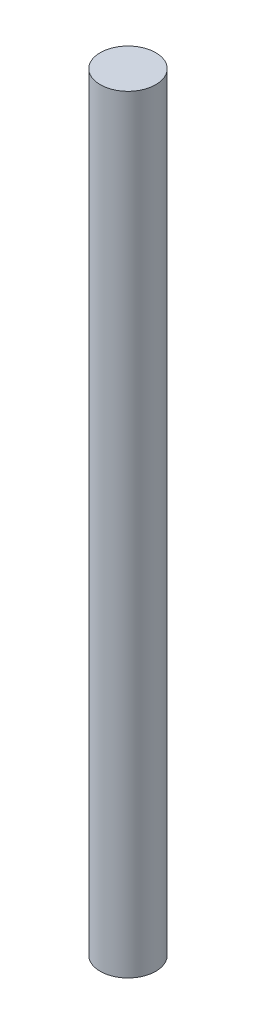
ISO-10303-21;
HEADER;
FILE_DESCRIPTION(('STEP AP214'),'2;1');
FILE_NAME('part.step','',(''),(''),'','','');
FILE_SCHEMA(('AUTOMOTIVE_DESIGN { 1 0 10303 214 1 1 1 1 }'));
ENDSEC;
DATA;
#1=APPLICATION_CONTEXT('core data for automotive mechanical design processes');
#2=APPLICATION_PROTOCOL_DEFINITION('international standard','automotive_design',2000,#1);
#3=PRODUCT_CONTEXT('',#1,'mechanical');
#4=PRODUCT('Part','Part','',(#3));
#5=PRODUCT_RELATED_PRODUCT_CATEGORY('part','',(#4));
#6=PRODUCT_DEFINITION_FORMATION('','',#4);
#7=PRODUCT_DEFINITION_CONTEXT('part definition',#1,'design');
#8=PRODUCT_DEFINITION('design','',#6,#7);
#9=PRODUCT_DEFINITION_SHAPE('','',#8);
#10=(LENGTH_UNIT() NAMED_UNIT(*) SI_UNIT(.MILLI.,.METRE.));
#11=(NAMED_UNIT(*) PLANE_ANGLE_UNIT() SI_UNIT($,.RADIAN.));
#12=(NAMED_UNIT(*) SI_UNIT($,.STERADIAN.) SOLID_ANGLE_UNIT());
#13=UNCERTAINTY_MEASURE_WITH_UNIT(LENGTH_MEASURE(1.E-05),#10,'distance_accuracy_value','');
#14=(GEOMETRIC_REPRESENTATION_CONTEXT(3) GLOBAL_UNCERTAINTY_ASSIGNED_CONTEXT((#13)) GLOBAL_UNIT_ASSIGNED_CONTEXT((#10,
#11,#12)) REPRESENTATION_CONTEXT('',''));
#15=CARTESIAN_POINT('',(0.,0.,0.));
#16=DIRECTION('',(0.,0.,1.));
#17=DIRECTION('',(1.,0.,0.));
#18=AXIS2_PLACEMENT_3D('',#15,#16,#17);
#19=CARTESIAN_POINT('',(0.,83.,0.));
#20=DIRECTION('',(0.,-1.,0.));
#21=DIRECTION('',(0.,0.,-1.));
#22=AXIS2_PLACEMENT_3D('',#19,#20,#21);
#23=CYLINDRICAL_SURFACE('',#22,3.);
#24=CARTESIAN_POINT('',(0.,83.,0.));
#25=DIRECTION('',(0.,1.,0.));
#26=DIRECTION('',(0.,0.,1.));
#27=AXIS2_PLACEMENT_3D('',#24,#25,#26);
#28=CIRCLE('',#27,3.);
#29=CARTESIAN_POINT('',(0.,83.,3.));
#30=VERTEX_POINT('',#29);
#31=EDGE_CURVE('E10',#30,#30,#28,.T.);
#32=ORIENTED_EDGE('',*,*,#31,.F.);
#33=EDGE_LOOP('',(#32));
#34=FACE_BOUND('',#33,.T.);
#35=CARTESIAN_POINT('',(0.,0.,0.));
#36=DIRECTION('',(0.,1.,0.));
#37=DIRECTION('',(0.,0.,1.));
#38=AXIS2_PLACEMENT_3D('',#35,#36,#37);
#39=CIRCLE('',#38,3.);
#40=CARTESIAN_POINT('',(0.,0.,3.));
#41=VERTEX_POINT('',#40);
#42=EDGE_CURVE('E38',#41,#41,#39,.T.);
#43=ORIENTED_EDGE('',*,*,#42,.T.);
#44=EDGE_LOOP('',(#43));
#45=FACE_BOUND('',#44,.T.);
#46=ADVANCED_FACE('F35',(#34,#45),#23,.T.);
#47=CARTESIAN_POINT('',(0.,83.,0.));
#48=DIRECTION('',(0.,1.,0.));
#49=DIRECTION('',(0.,0.,1.));
#50=AXIS2_PLACEMENT_3D('',#47,#48,#49);
#51=PLANE('',#50);
#52=ORIENTED_EDGE('',*,*,#31,.T.);
#53=EDGE_LOOP('',(#52));
#54=FACE_BOUND('',#53,.T.);
#55=ADVANCED_FACE('F50',(#54),#51,.T.);
#56=CARTESIAN_POINT('',(0.,0.,0.));
#57=DIRECTION('',(0.,1.,0.));
#58=DIRECTION('',(0.,0.,1.));
#59=AXIS2_PLACEMENT_3D('',#56,#57,#58);
#60=PLANE('',#59);
#61=ORIENTED_EDGE('',*,*,#42,.F.);
#62=EDGE_LOOP('',(#61));
#63=FACE_BOUND('',#62,.T.);
#64=ADVANCED_FACE('F48',(#63),#60,.F.);
#65=CLOSED_SHELL('',(#46,#55,#64));
#66=MANIFOLD_SOLID_BREP('B2',#65);
#67=ADVANCED_BREP_SHAPE_REPRESENTATION('',(#18,#66),#14);
#68=SHAPE_DEFINITION_REPRESENTATION(#9,#67);
ENDSEC;
END-ISO-10303-21;
